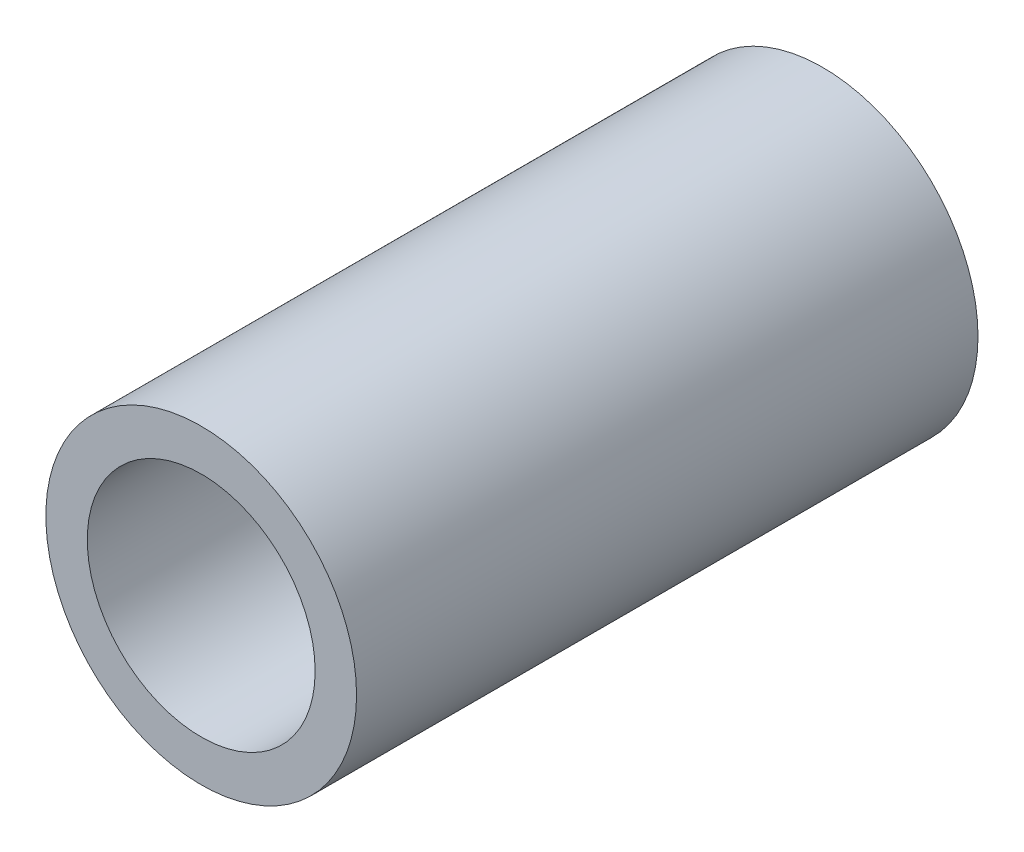
ISO-10303-21;
HEADER;
FILE_DESCRIPTION(('STEP AP214'),'2;1');
FILE_NAME('part.step','',(''),(''),'','','');
FILE_SCHEMA(('AUTOMOTIVE_DESIGN { 1 0 10303 214 1 1 1 1 }'));
ENDSEC;
DATA;
#1=APPLICATION_CONTEXT('core data for automotive mechanical design processes');
#2=APPLICATION_PROTOCOL_DEFINITION('international standard','automotive_design',2000,#1);
#3=PRODUCT_CONTEXT('',#1,'mechanical');
#4=PRODUCT('Part','Part','',(#3));
#5=PRODUCT_RELATED_PRODUCT_CATEGORY('part','',(#4));
#6=PRODUCT_DEFINITION_FORMATION('','',#4);
#7=PRODUCT_DEFINITION_CONTEXT('part definition',#1,'design');
#8=PRODUCT_DEFINITION('design','',#6,#7);
#9=PRODUCT_DEFINITION_SHAPE('','',#8);
#10=(LENGTH_UNIT() NAMED_UNIT(*) SI_UNIT(.MILLI.,.METRE.));
#11=(NAMED_UNIT(*) PLANE_ANGLE_UNIT() SI_UNIT($,.RADIAN.));
#12=(NAMED_UNIT(*) SI_UNIT($,.STERADIAN.) SOLID_ANGLE_UNIT());
#13=UNCERTAINTY_MEASURE_WITH_UNIT(LENGTH_MEASURE(1.E-05),#10,'distance_accuracy_value','');
#14=(GEOMETRIC_REPRESENTATION_CONTEXT(3) GLOBAL_UNCERTAINTY_ASSIGNED_CONTEXT((#13)) GLOBAL_UNIT_ASSIGNED_CONTEXT((#10,
#11,#12)) REPRESENTATION_CONTEXT('',''));
#15=CARTESIAN_POINT('',(0.,0.,0.));
#16=DIRECTION('',(0.,0.,1.));
#17=DIRECTION('',(1.,0.,0.));
#18=AXIS2_PLACEMENT_3D('',#15,#16,#17);
#19=CARTESIAN_POINT('',(0.,0.,120.));
#20=DIRECTION('',(0.,0.,-1.));
#21=DIRECTION('',(-1.,0.,0.));
#22=AXIS2_PLACEMENT_3D('',#19,#20,#21);
#23=CYLINDRICAL_SURFACE('',#22,30.);
#24=CARTESIAN_POINT('',(0.,0.,120.));
#25=DIRECTION('',(0.,0.,1.));
#26=DIRECTION('',(1.,0.,0.));
#27=AXIS2_PLACEMENT_3D('',#24,#25,#26);
#28=CIRCLE('',#27,30.);
#29=CARTESIAN_POINT('',(30.,0.,120.));
#30=VERTEX_POINT('',#29);
#31=EDGE_CURVE('E10',#30,#30,#28,.T.);
#32=ORIENTED_EDGE('',*,*,#31,.F.);
#33=EDGE_LOOP('',(#32));
#34=FACE_BOUND('',#33,.T.);
#35=CARTESIAN_POINT('',(0.,0.,0.));
#36=DIRECTION('',(0.,0.,1.));
#37=DIRECTION('',(1.,0.,0.));
#38=AXIS2_PLACEMENT_3D('',#35,#36,#37);
#39=CIRCLE('',#38,30.);
#40=CARTESIAN_POINT('',(30.,0.,0.));
#41=VERTEX_POINT('',#40);
#42=EDGE_CURVE('E45',#41,#41,#39,.T.);
#43=ORIENTED_EDGE('',*,*,#42,.T.);
#44=EDGE_LOOP('',(#43));
#45=FACE_BOUND('',#44,.T.);
#46=ADVANCED_FACE('F37',(#34,#45),#23,.T.);
#47=CARTESIAN_POINT('',(0.,0.,120.));
#48=DIRECTION('',(0.,0.,1.));
#49=DIRECTION('',(1.,0.,0.));
#50=AXIS2_PLACEMENT_3D('',#47,#48,#49);
#51=PLANE('',#50);
#52=CARTESIAN_POINT('',(0.,0.,120.));
#53=DIRECTION('',(0.,0.,1.));
#54=DIRECTION('',(1.,0.,0.));
#55=AXIS2_PLACEMENT_3D('',#52,#53,#54);
#56=CIRCLE('',#55,22.);
#57=CARTESIAN_POINT('',(22.,0.,120.));
#58=VERTEX_POINT('',#57);
#59=EDGE_CURVE('E52',#58,#58,#56,.T.);
#60=ORIENTED_EDGE('',*,*,#59,.F.);
#61=EDGE_LOOP('',(#60));
#62=FACE_BOUND('',#61,.T.);
#63=ORIENTED_EDGE('',*,*,#31,.T.);
#64=EDGE_LOOP('',(#63));
#65=FACE_BOUND('',#64,.T.);
#66=ADVANCED_FACE('F70',(#62,#65),#51,.T.);
#67=CARTESIAN_POINT('',(0.,0.,0.));
#68=DIRECTION('',(0.,0.,1.));
#69=DIRECTION('',(1.,0.,0.));
#70=AXIS2_PLACEMENT_3D('',#67,#68,#69);
#71=PLANE('',#70);
#72=CARTESIAN_POINT('',(0.,0.,0.));
#73=DIRECTION('',(0.,0.,1.));
#74=DIRECTION('',(1.,0.,0.));
#75=AXIS2_PLACEMENT_3D('',#72,#73,#74);
#76=CIRCLE('',#75,22.);
#77=CARTESIAN_POINT('',(22.,0.,0.));
#78=VERTEX_POINT('',#77);
#79=EDGE_CURVE('E40',#78,#78,#76,.T.);
#80=ORIENTED_EDGE('',*,*,#79,.T.);
#81=EDGE_LOOP('',(#80));
#82=FACE_BOUND('',#81,.T.);
#83=ORIENTED_EDGE('',*,*,#42,.F.);
#84=EDGE_LOOP('',(#83));
#85=FACE_BOUND('',#84,.T.);
#86=ADVANCED_FACE('F61',(#82,#85),#71,.F.);
#87=CARTESIAN_POINT('',(0.,0.,-20.));
#88=DIRECTION('',(0.,0.,1.));
#89=DIRECTION('',(1.,0.,0.));
#90=AXIS2_PLACEMENT_3D('',#87,#88,#89);
#91=CYLINDRICAL_SURFACE('',#90,22.);
#92=ORIENTED_EDGE('',*,*,#59,.T.);
#93=EDGE_LOOP('',(#92));
#94=FACE_BOUND('',#93,.T.);
#95=ORIENTED_EDGE('',*,*,#79,.F.);
#96=EDGE_LOOP('',(#95));
#97=FACE_BOUND('',#96,.T.);
#98=ADVANCED_FACE('F64',(#94,#97),#91,.F.);
#99=CLOSED_SHELL('',(#46,#66,#86,#98));
#100=MANIFOLD_SOLID_BREP('B2',#99);
#101=ADVANCED_BREP_SHAPE_REPRESENTATION('',(#18,#100),#14);
#102=SHAPE_DEFINITION_REPRESENTATION(#9,#101);
ENDSEC;
END-ISO-10303-21;
